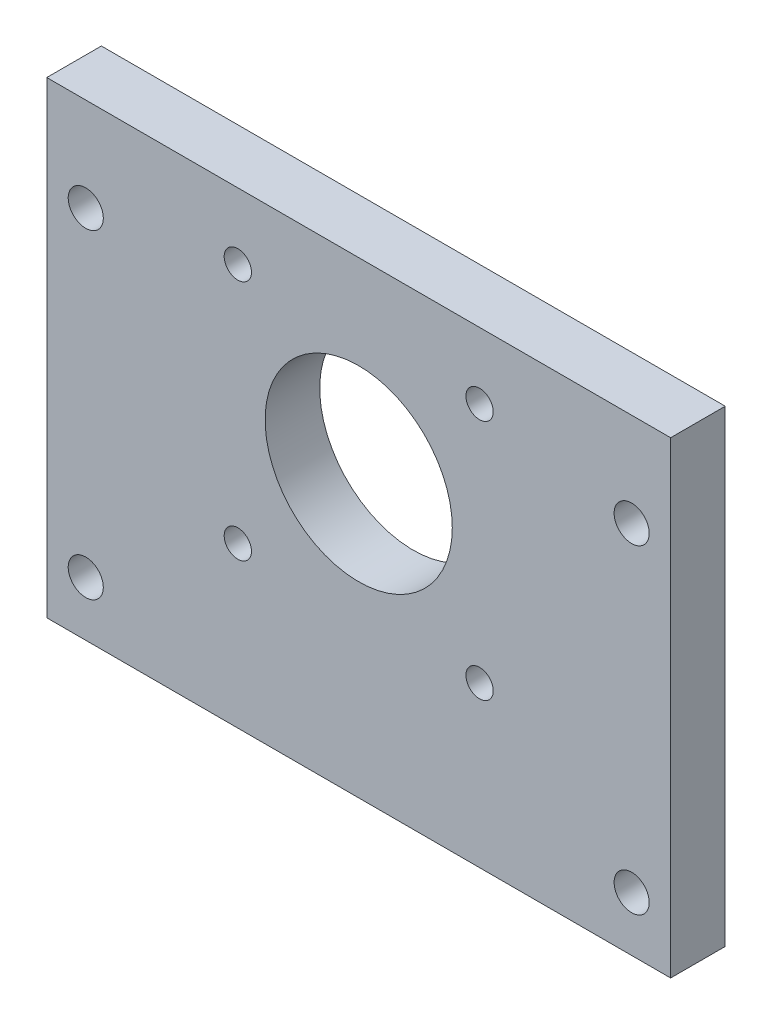
ISO-10303-21;
HEADER;
FILE_DESCRIPTION(('STEP AP214'),'2;1');
FILE_NAME('part.step','',(''),(''),'','','');
FILE_SCHEMA(('AUTOMOTIVE_DESIGN { 1 0 10303 214 1 1 1 1 }'));
ENDSEC;
DATA;
#1=APPLICATION_CONTEXT('core data for automotive mechanical design processes');
#2=APPLICATION_PROTOCOL_DEFINITION('international standard','automotive_design',2000,#1);
#3=PRODUCT_CONTEXT('',#1,'mechanical');
#4=PRODUCT('Part','Part','',(#3));
#5=PRODUCT_RELATED_PRODUCT_CATEGORY('part','',(#4));
#6=PRODUCT_DEFINITION_FORMATION('','',#4);
#7=PRODUCT_DEFINITION_CONTEXT('part definition',#1,'design');
#8=PRODUCT_DEFINITION('design','',#6,#7);
#9=PRODUCT_DEFINITION_SHAPE('','',#8);
#10=(LENGTH_UNIT() NAMED_UNIT(*) SI_UNIT(.MILLI.,.METRE.));
#11=(NAMED_UNIT(*) PLANE_ANGLE_UNIT() SI_UNIT($,.RADIAN.));
#12=(NAMED_UNIT(*) SI_UNIT($,.STERADIAN.) SOLID_ANGLE_UNIT());
#13=UNCERTAINTY_MEASURE_WITH_UNIT(LENGTH_MEASURE(1.E-05),#10,'distance_accuracy_value','');
#14=(GEOMETRIC_REPRESENTATION_CONTEXT(3) GLOBAL_UNCERTAINTY_ASSIGNED_CONTEXT((#13)) GLOBAL_UNIT_ASSIGNED_CONTEXT((#10,
#11,#12)) REPRESENTATION_CONTEXT('',''));
#15=CARTESIAN_POINT('',(0.,0.,0.));
#16=DIRECTION('',(0.,0.,1.));
#17=DIRECTION('',(1.,0.,0.));
#18=AXIS2_PLACEMENT_3D('',#15,#16,#17);
#19=CARTESIAN_POINT('',(0.,0.,7.));
#20=DIRECTION('',(0.,0.,1.));
#21=DIRECTION('',(1.,0.,0.));
#22=AXIS2_PLACEMENT_3D('',#19,#20,#21);
#23=PLANE('',#22);
#24=CARTESIAN_POINT('',(75.,7.,7.));
#25=DIRECTION('',(0.,0.,1.));
#26=DIRECTION('',(1.,0.,0.));
#27=AXIS2_PLACEMENT_3D('',#24,#25,#26);
#28=CIRCLE('',#27,2.25);
#29=CARTESIAN_POINT('',(77.25,7.,7.));
#30=VERTEX_POINT('',#29);
#31=EDGE_CURVE('E157',#30,#30,#28,.T.);
#32=ORIENTED_EDGE('',*,*,#31,.F.);
#33=EDGE_LOOP('',(#32));
#34=FACE_BOUND('',#33,.T.);
#35=CARTESIAN_POINT('',(5.,7.,7.));
#36=DIRECTION('',(0.,0.,1.));
#37=DIRECTION('',(1.,0.,0.));
#38=AXIS2_PLACEMENT_3D('',#35,#36,#37);
#39=CIRCLE('',#38,2.25);
#40=CARTESIAN_POINT('',(7.25,7.,7.));
#41=VERTEX_POINT('',#40);
#42=EDGE_CURVE('E145',#41,#41,#39,.T.);
#43=ORIENTED_EDGE('',*,*,#42,.F.);
#44=EDGE_LOOP('',(#43));
#45=FACE_BOUND('',#44,.T.);
#46=CARTESIAN_POINT('',(55.5,20.5,7.));
#47=DIRECTION('',(0.,0.,1.));
#48=DIRECTION('',(1.,0.,0.));
#49=AXIS2_PLACEMENT_3D('',#46,#47,#48);
#50=CIRCLE('',#49,1.75);
#51=CARTESIAN_POINT('',(57.25,20.5,7.));
#52=VERTEX_POINT('',#51);
#53=EDGE_CURVE('E133',#52,#52,#50,.T.);
#54=ORIENTED_EDGE('',*,*,#53,.F.);
#55=EDGE_LOOP('',(#54));
#56=FACE_BOUND('',#55,.T.);
#57=CARTESIAN_POINT('',(24.5,20.5,7.));
#58=DIRECTION('',(0.,0.,1.));
#59=DIRECTION('',(1.,0.,0.));
#60=AXIS2_PLACEMENT_3D('',#57,#58,#59);
#61=CIRCLE('',#60,1.75);
#62=CARTESIAN_POINT('',(26.25,20.5,7.));
#63=VERTEX_POINT('',#62);
#64=EDGE_CURVE('E121',#63,#63,#61,.T.);
#65=ORIENTED_EDGE('',*,*,#64,.F.);
#66=EDGE_LOOP('',(#65));
#67=FACE_BOUND('',#66,.T.);
#68=DIRECTION('',(0.,-1.,0.));
#69=VECTOR('',#68,1.);
#70=CARTESIAN_POINT('',(0.,60.,7.));
#71=LINE('',#70,#69);
#72=CARTESIAN_POINT('',(0.,60.,7.));
#73=VERTEX_POINT('',#72);
#74=CARTESIAN_POINT('',(0.,0.,7.));
#75=VERTEX_POINT('',#74);
#76=EDGE_CURVE('E91',#73,#75,#71,.T.);
#77=ORIENTED_EDGE('',*,*,#76,.T.);
#78=DIRECTION('',(1.,0.,0.));
#79=VECTOR('',#78,1.);
#80=CARTESIAN_POINT('',(0.,0.,7.));
#81=LINE('',#80,#79);
#82=CARTESIAN_POINT('',(80.,0.,7.));
#83=VERTEX_POINT('',#82);
#84=EDGE_CURVE('E86',#75,#83,#81,.T.);
#85=ORIENTED_EDGE('',*,*,#84,.T.);
#86=DIRECTION('',(0.,1.,0.));
#87=VECTOR('',#86,1.);
#88=CARTESIAN_POINT('',(80.,0.,7.));
#89=LINE('',#88,#87);
#90=CARTESIAN_POINT('',(80.,60.,7.));
#91=VERTEX_POINT('',#90);
#92=EDGE_CURVE('E89',#83,#91,#89,.T.);
#93=ORIENTED_EDGE('',*,*,#92,.T.);
#94=DIRECTION('',(-1.,0.,0.));
#95=VECTOR('',#94,1.);
#96=CARTESIAN_POINT('',(80.,60.,7.));
#97=LINE('',#96,#95);
#98=EDGE_CURVE('E56',#91,#73,#97,.T.);
#99=ORIENTED_EDGE('',*,*,#98,.T.);
#100=EDGE_LOOP('',(#77,#85,#93,#99));
#101=FACE_BOUND('',#100,.T.);
#102=CARTESIAN_POINT('',(40.,36.,7.));
#103=DIRECTION('',(0.,0.,1.));
#104=DIRECTION('',(1.,0.,0.));
#105=AXIS2_PLACEMENT_3D('',#102,#103,#104);
#106=CIRCLE('',#105,12.);
#107=CARTESIAN_POINT('',(52.,36.,7.));
#108=VERTEX_POINT('',#107);
#109=EDGE_CURVE('E106',#108,#108,#106,.T.);
#110=ORIENTED_EDGE('',*,*,#109,.F.);
#111=EDGE_LOOP('',(#110));
#112=FACE_BOUND('',#111,.T.);
#113=CARTESIAN_POINT('',(24.5,51.5,7.));
#114=DIRECTION('',(0.,0.,1.));
#115=DIRECTION('',(1.,0.,0.));
#116=AXIS2_PLACEMENT_3D('',#113,#114,#115);
#117=CIRCLE('',#116,1.75);
#118=CARTESIAN_POINT('',(26.25,51.5,7.));
#119=VERTEX_POINT('',#118);
#120=EDGE_CURVE('E127',#119,#119,#117,.T.);
#121=ORIENTED_EDGE('',*,*,#120,.F.);
#122=EDGE_LOOP('',(#121));
#123=FACE_BOUND('',#122,.T.);
#124=CARTESIAN_POINT('',(55.5,51.5,7.));
#125=DIRECTION('',(0.,0.,1.));
#126=DIRECTION('',(1.,0.,0.));
#127=AXIS2_PLACEMENT_3D('',#124,#125,#126);
#128=CIRCLE('',#127,1.75);
#129=CARTESIAN_POINT('',(57.25,51.5,7.));
#130=VERTEX_POINT('',#129);
#131=EDGE_CURVE('E139',#130,#130,#128,.T.);
#132=ORIENTED_EDGE('',*,*,#131,.F.);
#133=EDGE_LOOP('',(#132));
#134=FACE_BOUND('',#133,.T.);
#135=CARTESIAN_POINT('',(5.,48.,7.));
#136=DIRECTION('',(0.,0.,1.));
#137=DIRECTION('',(1.,0.,0.));
#138=AXIS2_PLACEMENT_3D('',#135,#136,#137);
#139=CIRCLE('',#138,2.25);
#140=CARTESIAN_POINT('',(7.25,48.,7.));
#141=VERTEX_POINT('',#140);
#142=EDGE_CURVE('E151',#141,#141,#139,.T.);
#143=ORIENTED_EDGE('',*,*,#142,.F.);
#144=EDGE_LOOP('',(#143));
#145=FACE_BOUND('',#144,.T.);
#146=CARTESIAN_POINT('',(75.,48.,7.));
#147=DIRECTION('',(0.,0.,1.));
#148=DIRECTION('',(1.,0.,0.));
#149=AXIS2_PLACEMENT_3D('',#146,#147,#148);
#150=CIRCLE('',#149,2.25);
#151=CARTESIAN_POINT('',(77.25,48.,7.));
#152=VERTEX_POINT('',#151);
#153=EDGE_CURVE('E163',#152,#152,#150,.T.);
#154=ORIENTED_EDGE('',*,*,#153,.F.);
#155=EDGE_LOOP('',(#154));
#156=FACE_BOUND('',#155,.T.);
#157=ADVANCED_FACE('F39',(#34,#45,#56,#67,#101,#112,#123,#134,#145,#156),#23,.T.);
#158=CARTESIAN_POINT('',(0.,0.,0.));
#159=DIRECTION('',(0.,0.,1.));
#160=DIRECTION('',(1.,0.,0.));
#161=AXIS2_PLACEMENT_3D('',#158,#159,#160);
#162=PLANE('',#161);
#163=DIRECTION('',(0.,-1.,0.));
#164=VECTOR('',#163,1.);
#165=CARTESIAN_POINT('',(0.,60.,0.));
#166=LINE('',#165,#164);
#167=CARTESIAN_POINT('',(0.,60.,0.));
#168=VERTEX_POINT('',#167);
#169=CARTESIAN_POINT('',(0.,0.,0.));
#170=VERTEX_POINT('',#169);
#171=EDGE_CURVE('E103',#168,#170,#166,.T.);
#172=ORIENTED_EDGE('',*,*,#171,.F.);
#173=DIRECTION('',(-1.,0.,0.));
#174=VECTOR('',#173,1.);
#175=CARTESIAN_POINT('',(80.,60.,0.));
#176=LINE('',#175,#174);
#177=CARTESIAN_POINT('',(80.,60.,0.));
#178=VERTEX_POINT('',#177);
#179=EDGE_CURVE('E79',#178,#168,#176,.T.);
#180=ORIENTED_EDGE('',*,*,#179,.F.);
#181=DIRECTION('',(0.,1.,0.));
#182=VECTOR('',#181,1.);
#183=CARTESIAN_POINT('',(80.,0.,0.));
#184=LINE('',#183,#182);
#185=CARTESIAN_POINT('',(80.,0.,0.));
#186=VERTEX_POINT('',#185);
#187=EDGE_CURVE('E73',#186,#178,#184,.T.);
#188=ORIENTED_EDGE('',*,*,#187,.F.);
#189=DIRECTION('',(1.,0.,0.));
#190=VECTOR('',#189,1.);
#191=CARTESIAN_POINT('',(0.,0.,0.));
#192=LINE('',#191,#190);
#193=EDGE_CURVE('E95',#170,#186,#192,.T.);
#194=ORIENTED_EDGE('',*,*,#193,.F.);
#195=EDGE_LOOP('',(#172,#180,#188,#194));
#196=FACE_BOUND('',#195,.T.);
#197=CARTESIAN_POINT('',(40.,36.,0.));
#198=DIRECTION('',(0.,0.,1.));
#199=DIRECTION('',(1.,0.,0.));
#200=AXIS2_PLACEMENT_3D('',#197,#198,#199);
#201=CIRCLE('',#200,12.);
#202=CARTESIAN_POINT('',(52.,36.,0.));
#203=VERTEX_POINT('',#202);
#204=EDGE_CURVE('E118',#203,#203,#201,.T.);
#205=ORIENTED_EDGE('',*,*,#204,.T.);
#206=EDGE_LOOP('',(#205));
#207=FACE_BOUND('',#206,.T.);
#208=CARTESIAN_POINT('',(24.5,20.5,0.));
#209=DIRECTION('',(0.,0.,1.));
#210=DIRECTION('',(1.,0.,0.));
#211=AXIS2_PLACEMENT_3D('',#208,#209,#210);
#212=CIRCLE('',#211,1.75);
#213=CARTESIAN_POINT('',(26.25,20.5,0.));
#214=VERTEX_POINT('',#213);
#215=EDGE_CURVE('E124',#214,#214,#212,.T.);
#216=ORIENTED_EDGE('',*,*,#215,.T.);
#217=EDGE_LOOP('',(#216));
#218=FACE_BOUND('',#217,.T.);
#219=CARTESIAN_POINT('',(24.5,51.5,0.));
#220=DIRECTION('',(0.,0.,1.));
#221=DIRECTION('',(1.,0.,0.));
#222=AXIS2_PLACEMENT_3D('',#219,#220,#221);
#223=CIRCLE('',#222,1.75);
#224=CARTESIAN_POINT('',(26.25,51.5,0.));
#225=VERTEX_POINT('',#224);
#226=EDGE_CURVE('E130',#225,#225,#223,.T.);
#227=ORIENTED_EDGE('',*,*,#226,.T.);
#228=EDGE_LOOP('',(#227));
#229=FACE_BOUND('',#228,.T.);
#230=CARTESIAN_POINT('',(55.5,20.5,0.));
#231=DIRECTION('',(0.,0.,1.));
#232=DIRECTION('',(1.,0.,0.));
#233=AXIS2_PLACEMENT_3D('',#230,#231,#232);
#234=CIRCLE('',#233,1.75);
#235=CARTESIAN_POINT('',(57.25,20.5,0.));
#236=VERTEX_POINT('',#235);
#237=EDGE_CURVE('E136',#236,#236,#234,.T.);
#238=ORIENTED_EDGE('',*,*,#237,.T.);
#239=EDGE_LOOP('',(#238));
#240=FACE_BOUND('',#239,.T.);
#241=CARTESIAN_POINT('',(55.5,51.5,0.));
#242=DIRECTION('',(0.,0.,1.));
#243=DIRECTION('',(1.,0.,0.));
#244=AXIS2_PLACEMENT_3D('',#241,#242,#243);
#245=CIRCLE('',#244,1.75);
#246=CARTESIAN_POINT('',(57.25,51.5,0.));
#247=VERTEX_POINT('',#246);
#248=EDGE_CURVE('E142',#247,#247,#245,.T.);
#249=ORIENTED_EDGE('',*,*,#248,.T.);
#250=EDGE_LOOP('',(#249));
#251=FACE_BOUND('',#250,.T.);
#252=CARTESIAN_POINT('',(5.,7.,0.));
#253=DIRECTION('',(0.,0.,1.));
#254=DIRECTION('',(1.,0.,0.));
#255=AXIS2_PLACEMENT_3D('',#252,#253,#254);
#256=CIRCLE('',#255,2.25);
#257=CARTESIAN_POINT('',(7.25,7.,0.));
#258=VERTEX_POINT('',#257);
#259=EDGE_CURVE('E148',#258,#258,#256,.T.);
#260=ORIENTED_EDGE('',*,*,#259,.T.);
#261=EDGE_LOOP('',(#260));
#262=FACE_BOUND('',#261,.T.);
#263=CARTESIAN_POINT('',(5.,48.,0.));
#264=DIRECTION('',(0.,0.,1.));
#265=DIRECTION('',(1.,0.,0.));
#266=AXIS2_PLACEMENT_3D('',#263,#264,#265);
#267=CIRCLE('',#266,2.25);
#268=CARTESIAN_POINT('',(7.25,48.,0.));
#269=VERTEX_POINT('',#268);
#270=EDGE_CURVE('E154',#269,#269,#267,.T.);
#271=ORIENTED_EDGE('',*,*,#270,.T.);
#272=EDGE_LOOP('',(#271));
#273=FACE_BOUND('',#272,.T.);
#274=CARTESIAN_POINT('',(75.,7.,0.));
#275=DIRECTION('',(0.,0.,1.));
#276=DIRECTION('',(1.,0.,0.));
#277=AXIS2_PLACEMENT_3D('',#274,#275,#276);
#278=CIRCLE('',#277,2.25);
#279=CARTESIAN_POINT('',(77.25,7.,0.));
#280=VERTEX_POINT('',#279);
#281=EDGE_CURVE('E160',#280,#280,#278,.T.);
#282=ORIENTED_EDGE('',*,*,#281,.T.);
#283=EDGE_LOOP('',(#282));
#284=FACE_BOUND('',#283,.T.);
#285=CARTESIAN_POINT('',(75.,48.,0.));
#286=DIRECTION('',(0.,0.,1.));
#287=DIRECTION('',(1.,0.,0.));
#288=AXIS2_PLACEMENT_3D('',#285,#286,#287);
#289=CIRCLE('',#288,2.25);
#290=CARTESIAN_POINT('',(77.25,48.,0.));
#291=VERTEX_POINT('',#290);
#292=EDGE_CURVE('E166',#291,#291,#289,.T.);
#293=ORIENTED_EDGE('',*,*,#292,.T.);
#294=EDGE_LOOP('',(#293));
#295=FACE_BOUND('',#294,.T.);
#296=ADVANCED_FACE('F114',(#196,#207,#218,#229,#240,#251,#262,#273,#284,#295),#162,.F.);
#297=CARTESIAN_POINT('',(0.,60.,7.));
#298=DIRECTION('',(1.,0.,0.));
#299=DIRECTION('',(0.,0.,-1.));
#300=AXIS2_PLACEMENT_3D('',#297,#298,#299);
#301=PLANE('',#300);
#302=ORIENTED_EDGE('',*,*,#171,.T.);
#303=DIRECTION('',(0.,0.,-1.));
#304=VECTOR('',#303,1.);
#305=CARTESIAN_POINT('',(0.,0.,7.));
#306=LINE('',#305,#304);
#307=EDGE_CURVE('E11',#75,#170,#306,.T.);
#308=ORIENTED_EDGE('',*,*,#307,.F.);
#309=ORIENTED_EDGE('',*,*,#76,.F.);
#310=DIRECTION('',(0.,0.,-1.));
#311=VECTOR('',#310,1.);
#312=CARTESIAN_POINT('',(0.,60.,7.));
#313=LINE('',#312,#311);
#314=EDGE_CURVE('E99',#73,#168,#313,.T.);
#315=ORIENTED_EDGE('',*,*,#314,.T.);
#316=EDGE_LOOP('',(#302,#308,#309,#315));
#317=FACE_BOUND('',#316,.T.);
#318=ADVANCED_FACE('F41',(#317),#301,.F.);
#319=CARTESIAN_POINT('',(0.,0.,7.));
#320=DIRECTION('',(0.,1.,0.));
#321=DIRECTION('',(0.,0.,1.));
#322=AXIS2_PLACEMENT_3D('',#319,#320,#321);
#323=PLANE('',#322);
#324=ORIENTED_EDGE('',*,*,#193,.T.);
#325=DIRECTION('',(0.,0.,-1.));
#326=VECTOR('',#325,1.);
#327=CARTESIAN_POINT('',(80.,0.,7.));
#328=LINE('',#327,#326);
#329=EDGE_CURVE('E48',#83,#186,#328,.T.);
#330=ORIENTED_EDGE('',*,*,#329,.F.);
#331=ORIENTED_EDGE('',*,*,#84,.F.);
#332=ORIENTED_EDGE('',*,*,#307,.T.);
#333=EDGE_LOOP('',(#324,#330,#331,#332));
#334=FACE_BOUND('',#333,.T.);
#335=ADVANCED_FACE('F94',(#334),#323,.F.);
#336=CARTESIAN_POINT('',(80.,0.,7.));
#337=DIRECTION('',(-1.,0.,0.));
#338=DIRECTION('',(0.,0.,1.));
#339=AXIS2_PLACEMENT_3D('',#336,#337,#338);
#340=PLANE('',#339);
#341=ORIENTED_EDGE('',*,*,#187,.T.);
#342=DIRECTION('',(0.,0.,-1.));
#343=VECTOR('',#342,1.);
#344=CARTESIAN_POINT('',(80.,60.,7.));
#345=LINE('',#344,#343);
#346=EDGE_CURVE('E96',#91,#178,#345,.T.);
#347=ORIENTED_EDGE('',*,*,#346,.F.);
#348=ORIENTED_EDGE('',*,*,#92,.F.);
#349=ORIENTED_EDGE('',*,*,#329,.T.);
#350=EDGE_LOOP('',(#341,#347,#348,#349));
#351=FACE_BOUND('',#350,.T.);
#352=ADVANCED_FACE('F97',(#351),#340,.F.);
#353=CARTESIAN_POINT('',(80.,60.,7.));
#354=DIRECTION('',(0.,-1.,0.));
#355=DIRECTION('',(0.,0.,-1.));
#356=AXIS2_PLACEMENT_3D('',#353,#354,#355);
#357=PLANE('',#356);
#358=ORIENTED_EDGE('',*,*,#179,.T.);
#359=ORIENTED_EDGE('',*,*,#314,.F.);
#360=ORIENTED_EDGE('',*,*,#98,.F.);
#361=ORIENTED_EDGE('',*,*,#346,.T.);
#362=EDGE_LOOP('',(#358,#359,#360,#361));
#363=FACE_BOUND('',#362,.T.);
#364=ADVANCED_FACE('F111',(#363),#357,.F.);
#365=CARTESIAN_POINT('',(40.,36.,7.));
#366=DIRECTION('',(0.,0.,-1.));
#367=DIRECTION('',(-1.,0.,0.));
#368=AXIS2_PLACEMENT_3D('',#365,#366,#367);
#369=CYLINDRICAL_SURFACE('',#368,12.);
#370=ORIENTED_EDGE('',*,*,#109,.T.);
#371=EDGE_LOOP('',(#370));
#372=FACE_BOUND('',#371,.T.);
#373=ORIENTED_EDGE('',*,*,#204,.F.);
#374=EDGE_LOOP('',(#373));
#375=FACE_BOUND('',#374,.T.);
#376=ADVANCED_FACE('F185',(#372,#375),#369,.F.);
#377=CARTESIAN_POINT('',(24.5,20.5,7.));
#378=DIRECTION('',(0.,0.,-1.));
#379=DIRECTION('',(-1.,0.,0.));
#380=AXIS2_PLACEMENT_3D('',#377,#378,#379);
#381=CYLINDRICAL_SURFACE('',#380,1.75);
#382=ORIENTED_EDGE('',*,*,#64,.T.);
#383=EDGE_LOOP('',(#382));
#384=FACE_BOUND('',#383,.T.);
#385=ORIENTED_EDGE('',*,*,#215,.F.);
#386=EDGE_LOOP('',(#385));
#387=FACE_BOUND('',#386,.T.);
#388=ADVANCED_FACE('F239',(#384,#387),#381,.F.);
#389=CARTESIAN_POINT('',(24.5,51.5,7.));
#390=DIRECTION('',(0.,0.,-1.));
#391=DIRECTION('',(-1.,0.,0.));
#392=AXIS2_PLACEMENT_3D('',#389,#390,#391);
#393=CYLINDRICAL_SURFACE('',#392,1.75);
#394=ORIENTED_EDGE('',*,*,#120,.T.);
#395=EDGE_LOOP('',(#394));
#396=FACE_BOUND('',#395,.T.);
#397=ORIENTED_EDGE('',*,*,#226,.F.);
#398=EDGE_LOOP('',(#397));
#399=FACE_BOUND('',#398,.T.);
#400=ADVANCED_FACE('F248',(#396,#399),#393,.F.);
#401=CARTESIAN_POINT('',(55.5,20.5,7.));
#402=DIRECTION('',(0.,0.,-1.));
#403=DIRECTION('',(-1.,0.,0.));
#404=AXIS2_PLACEMENT_3D('',#401,#402,#403);
#405=CYLINDRICAL_SURFACE('',#404,1.75);
#406=ORIENTED_EDGE('',*,*,#53,.T.);
#407=EDGE_LOOP('',(#406));
#408=FACE_BOUND('',#407,.T.);
#409=ORIENTED_EDGE('',*,*,#237,.F.);
#410=EDGE_LOOP('',(#409));
#411=FACE_BOUND('',#410,.T.);
#412=ADVANCED_FACE('F257',(#408,#411),#405,.F.);
#413=CARTESIAN_POINT('',(55.5,51.5,7.));
#414=DIRECTION('',(0.,0.,-1.));
#415=DIRECTION('',(-1.,0.,0.));
#416=AXIS2_PLACEMENT_3D('',#413,#414,#415);
#417=CYLINDRICAL_SURFACE('',#416,1.75);
#418=ORIENTED_EDGE('',*,*,#131,.T.);
#419=EDGE_LOOP('',(#418));
#420=FACE_BOUND('',#419,.T.);
#421=ORIENTED_EDGE('',*,*,#248,.F.);
#422=EDGE_LOOP('',(#421));
#423=FACE_BOUND('',#422,.T.);
#424=ADVANCED_FACE('F267',(#420,#423),#417,.F.);
#425=CARTESIAN_POINT('',(5.,7.,7.));
#426=DIRECTION('',(0.,0.,-1.));
#427=DIRECTION('',(-1.,0.,0.));
#428=AXIS2_PLACEMENT_3D('',#425,#426,#427);
#429=CYLINDRICAL_SURFACE('',#428,2.25);
#430=ORIENTED_EDGE('',*,*,#42,.T.);
#431=EDGE_LOOP('',(#430));
#432=FACE_BOUND('',#431,.T.);
#433=ORIENTED_EDGE('',*,*,#259,.F.);
#434=EDGE_LOOP('',(#433));
#435=FACE_BOUND('',#434,.T.);
#436=ADVANCED_FACE('F277',(#432,#435),#429,.F.);
#437=CARTESIAN_POINT('',(5.,48.,7.));
#438=DIRECTION('',(0.,0.,-1.));
#439=DIRECTION('',(-1.,0.,0.));
#440=AXIS2_PLACEMENT_3D('',#437,#438,#439);
#441=CYLINDRICAL_SURFACE('',#440,2.25);
#442=ORIENTED_EDGE('',*,*,#142,.T.);
#443=EDGE_LOOP('',(#442));
#444=FACE_BOUND('',#443,.T.);
#445=ORIENTED_EDGE('',*,*,#270,.F.);
#446=EDGE_LOOP('',(#445));
#447=FACE_BOUND('',#446,.T.);
#448=ADVANCED_FACE('F287',(#444,#447),#441,.F.);
#449=CARTESIAN_POINT('',(75.,7.,7.));
#450=DIRECTION('',(0.,0.,-1.));
#451=DIRECTION('',(-1.,0.,0.));
#452=AXIS2_PLACEMENT_3D('',#449,#450,#451);
#453=CYLINDRICAL_SURFACE('',#452,2.25);
#454=ORIENTED_EDGE('',*,*,#31,.T.);
#455=EDGE_LOOP('',(#454));
#456=FACE_BOUND('',#455,.T.);
#457=ORIENTED_EDGE('',*,*,#281,.F.);
#458=EDGE_LOOP('',(#457));
#459=FACE_BOUND('',#458,.T.);
#460=ADVANCED_FACE('F297',(#456,#459),#453,.F.);
#461=CARTESIAN_POINT('',(75.,48.,7.));
#462=DIRECTION('',(0.,0.,-1.));
#463=DIRECTION('',(-1.,0.,0.));
#464=AXIS2_PLACEMENT_3D('',#461,#462,#463);
#465=CYLINDRICAL_SURFACE('',#464,2.25);
#466=ORIENTED_EDGE('',*,*,#153,.T.);
#467=EDGE_LOOP('',(#466));
#468=FACE_BOUND('',#467,.T.);
#469=ORIENTED_EDGE('',*,*,#292,.F.);
#470=EDGE_LOOP('',(#469));
#471=FACE_BOUND('',#470,.T.);
#472=ADVANCED_FACE('F172',(#468,#471),#465,.F.);
#473=CLOSED_SHELL('',(#157,#296,#318,#335,#352,#364,#376,#388,#400,#412,#424,#436,#448,#460,#472));
#474=MANIFOLD_SOLID_BREP('B2',#473);
#475=ADVANCED_BREP_SHAPE_REPRESENTATION('',(#18,#474),#14);
#476=SHAPE_DEFINITION_REPRESENTATION(#9,#475);
ENDSEC;
END-ISO-10303-21;
